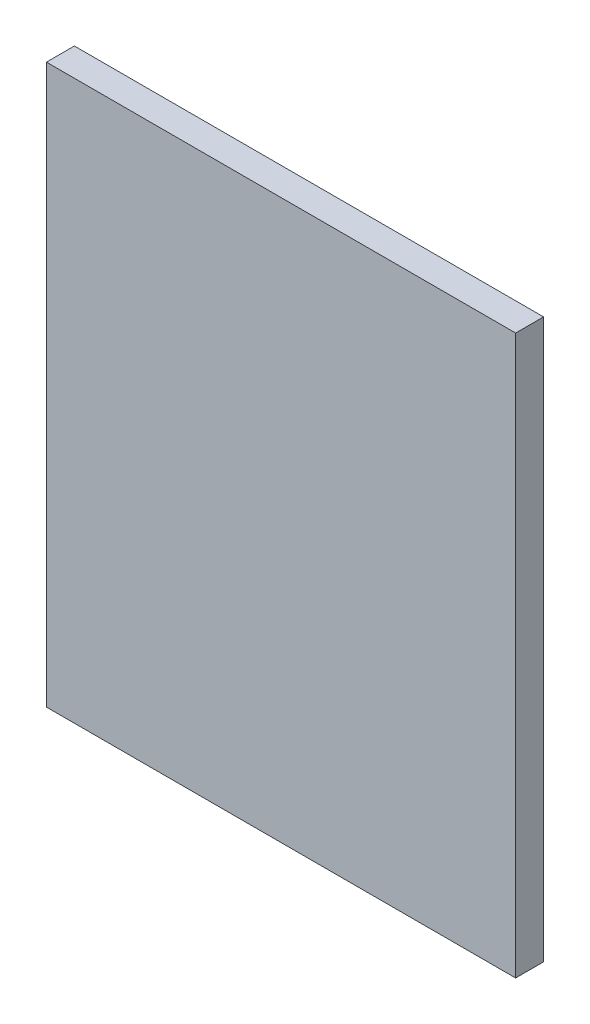
ISO-10303-21;
HEADER;
FILE_DESCRIPTION(('STEP AP214'),'2;1');
FILE_NAME('part.step','',(''),(''),'','','');
FILE_SCHEMA(('AUTOMOTIVE_DESIGN { 1 0 10303 214 1 1 1 1 }'));
ENDSEC;
DATA;
#1=APPLICATION_CONTEXT('core data for automotive mechanical design processes');
#2=APPLICATION_PROTOCOL_DEFINITION('international standard','automotive_design',2000,#1);
#3=PRODUCT_CONTEXT('',#1,'mechanical');
#4=PRODUCT('Part','Part','',(#3));
#5=PRODUCT_RELATED_PRODUCT_CATEGORY('part','',(#4));
#6=PRODUCT_DEFINITION_FORMATION('','',#4);
#7=PRODUCT_DEFINITION_CONTEXT('part definition',#1,'design');
#8=PRODUCT_DEFINITION('design','',#6,#7);
#9=PRODUCT_DEFINITION_SHAPE('','',#8);
#10=(LENGTH_UNIT() NAMED_UNIT(*) SI_UNIT(.MILLI.,.METRE.));
#11=(NAMED_UNIT(*) PLANE_ANGLE_UNIT() SI_UNIT($,.RADIAN.));
#12=(NAMED_UNIT(*) SI_UNIT($,.STERADIAN.) SOLID_ANGLE_UNIT());
#13=UNCERTAINTY_MEASURE_WITH_UNIT(LENGTH_MEASURE(1.E-05),#10,'distance_accuracy_value','');
#14=(GEOMETRIC_REPRESENTATION_CONTEXT(3) GLOBAL_UNCERTAINTY_ASSIGNED_CONTEXT((#13)) GLOBAL_UNIT_ASSIGNED_CONTEXT((#10,
#11,#12)) REPRESENTATION_CONTEXT('',''));
#15=CARTESIAN_POINT('',(0.,0.,0.));
#16=DIRECTION('',(0.,0.,1.));
#17=DIRECTION('',(1.,0.,0.));
#18=AXIS2_PLACEMENT_3D('',#15,#16,#17);
#19=CARTESIAN_POINT('',(-24.2012195121951,19.9115853658537,2.5));
#20=DIRECTION('',(1.,0.,0.));
#21=DIRECTION('',(0.,1.,0.));
#22=AXIS2_PLACEMENT_3D('',#19,#20,#21);
#23=PLANE('',#22);
#24=DIRECTION('',(0.,-1.,0.));
#25=VECTOR('',#24,1.);
#26=CARTESIAN_POINT('',(-24.2012195121951,19.9115853658537,0.));
#27=LINE('',#26,#25);
#28=CARTESIAN_POINT('',(-24.2012195121951,19.9115853658537,0.));
#29=VERTEX_POINT('',#28);
#30=CARTESIAN_POINT('',(-24.2012195121951,-30.0884146341463,0.));
#31=VERTEX_POINT('',#30);
#32=EDGE_CURVE('E96',#29,#31,#27,.T.);
#33=ORIENTED_EDGE('',*,*,#32,.T.);
#34=DIRECTION('',(0.,0.,-1.));
#35=VECTOR('',#34,1.);
#36=CARTESIAN_POINT('',(-24.2012195121951,-30.0884146341463,2.5));
#37=LINE('',#36,#35);
#38=CARTESIAN_POINT('',(-24.2012195121951,-30.0884146341463,2.5));
#39=VERTEX_POINT('',#38);
#40=EDGE_CURVE('E11',#39,#31,#37,.T.);
#41=ORIENTED_EDGE('',*,*,#40,.F.);
#42=DIRECTION('',(0.,-1.,0.));
#43=VECTOR('',#42,1.);
#44=CARTESIAN_POINT('',(-24.2012195121951,19.9115853658537,2.5));
#45=LINE('',#44,#43);
#46=CARTESIAN_POINT('',(-24.2012195121951,19.9115853658537,2.5));
#47=VERTEX_POINT('',#46);
#48=EDGE_CURVE('E84',#47,#39,#45,.T.);
#49=ORIENTED_EDGE('',*,*,#48,.F.);
#50=DIRECTION('',(0.,0.,-1.));
#51=VECTOR('',#50,1.);
#52=CARTESIAN_POINT('',(-24.2012195121951,19.9115853658537,2.5));
#53=LINE('',#52,#51);
#54=EDGE_CURVE('E92',#47,#29,#53,.T.);
#55=ORIENTED_EDGE('',*,*,#54,.T.);
#56=EDGE_LOOP('',(#33,#41,#49,#55));
#57=FACE_BOUND('',#56,.T.);
#58=ADVANCED_FACE('F33',(#57),#23,.F.);
#59=CARTESIAN_POINT('',(-24.2012195121951,-30.0884146341463,2.5));
#60=DIRECTION('',(0.,1.,0.));
#61=DIRECTION('',(0.,0.,1.));
#62=AXIS2_PLACEMENT_3D('',#59,#60,#61);
#63=PLANE('',#62);
#64=DIRECTION('',(1.,0.,0.));
#65=VECTOR('',#64,1.);
#66=CARTESIAN_POINT('',(-24.2012195121951,-30.0884146341463,0.));
#67=LINE('',#66,#65);
#68=CARTESIAN_POINT('',(17.7987804878049,-30.0884146341463,0.));
#69=VERTEX_POINT('',#68);
#70=EDGE_CURVE('E88',#31,#69,#67,.T.);
#71=ORIENTED_EDGE('',*,*,#70,.T.);
#72=DIRECTION('',(0.,0.,-1.));
#73=VECTOR('',#72,1.);
#74=CARTESIAN_POINT('',(17.7987804878049,-30.0884146341463,2.5));
#75=LINE('',#74,#73);
#76=CARTESIAN_POINT('',(17.7987804878049,-30.0884146341463,2.5));
#77=VERTEX_POINT('',#76);
#78=EDGE_CURVE('E41',#77,#69,#75,.T.);
#79=ORIENTED_EDGE('',*,*,#78,.F.);
#80=DIRECTION('',(1.,0.,0.));
#81=VECTOR('',#80,1.);
#82=CARTESIAN_POINT('',(-24.2012195121951,-30.0884146341463,2.5));
#83=LINE('',#82,#81);
#84=EDGE_CURVE('E79',#39,#77,#83,.T.);
#85=ORIENTED_EDGE('',*,*,#84,.F.);
#86=ORIENTED_EDGE('',*,*,#40,.T.);
#87=EDGE_LOOP('',(#71,#79,#85,#86));
#88=FACE_BOUND('',#87,.T.);
#89=ADVANCED_FACE('F87',(#88),#63,.F.);
#90=CARTESIAN_POINT('',(17.7987804878049,19.9115853658537,2.5));
#91=DIRECTION('',(-1.,0.,0.));
#92=DIRECTION('',(0.,-1.,0.));
#93=AXIS2_PLACEMENT_3D('',#90,#91,#92);
#94=PLANE('',#93);
#95=DIRECTION('',(0.,1.,0.));
#96=VECTOR('',#95,1.);
#97=CARTESIAN_POINT('',(17.7987804878049,19.9115853658537,0.));
#98=LINE('',#97,#96);
#99=CARTESIAN_POINT('',(17.7987804878049,19.9115853658537,0.));
#100=VERTEX_POINT('',#99);
#101=EDGE_CURVE('E66',#69,#100,#98,.T.);
#102=ORIENTED_EDGE('',*,*,#101,.T.);
#103=DIRECTION('',(0.,0.,-1.));
#104=VECTOR('',#103,1.);
#105=CARTESIAN_POINT('',(17.7987804878049,19.9115853658537,2.5));
#106=LINE('',#105,#104);
#107=CARTESIAN_POINT('',(17.7987804878049,19.9115853658537,2.5));
#108=VERTEX_POINT('',#107);
#109=EDGE_CURVE('E89',#108,#100,#106,.T.);
#110=ORIENTED_EDGE('',*,*,#109,.F.);
#111=DIRECTION('',(0.,1.,0.));
#112=VECTOR('',#111,1.);
#113=CARTESIAN_POINT('',(17.7987804878049,19.9115853658537,2.5));
#114=LINE('',#113,#112);
#115=EDGE_CURVE('E82',#77,#108,#114,.T.);
#116=ORIENTED_EDGE('',*,*,#115,.F.);
#117=ORIENTED_EDGE('',*,*,#78,.T.);
#118=EDGE_LOOP('',(#102,#110,#116,#117));
#119=FACE_BOUND('',#118,.T.);
#120=ADVANCED_FACE('F90',(#119),#94,.F.);
#121=CARTESIAN_POINT('',(-24.2012195121951,19.9115853658537,2.5));
#122=DIRECTION('',(0.,-1.,0.));
#123=DIRECTION('',(0.,0.,-1.));
#124=AXIS2_PLACEMENT_3D('',#121,#122,#123);
#125=PLANE('',#124);
#126=DIRECTION('',(-1.,0.,0.));
#127=VECTOR('',#126,1.);
#128=CARTESIAN_POINT('',(-24.2012195121951,19.9115853658537,0.));
#129=LINE('',#128,#127);
#130=EDGE_CURVE('E72',#100,#29,#129,.T.);
#131=ORIENTED_EDGE('',*,*,#130,.T.);
#132=ORIENTED_EDGE('',*,*,#54,.F.);
#133=DIRECTION('',(-1.,0.,0.));
#134=VECTOR('',#133,1.);
#135=CARTESIAN_POINT('',(-24.2012195121951,19.9115853658537,2.5));
#136=LINE('',#135,#134);
#137=EDGE_CURVE('E49',#108,#47,#136,.T.);
#138=ORIENTED_EDGE('',*,*,#137,.F.);
#139=ORIENTED_EDGE('',*,*,#109,.T.);
#140=EDGE_LOOP('',(#131,#132,#138,#139));
#141=FACE_BOUND('',#140,.T.);
#142=ADVANCED_FACE('F103',(#141),#125,.F.);
#143=CARTESIAN_POINT('',(0.,0.,2.5));
#144=DIRECTION('',(0.,0.,1.));
#145=DIRECTION('',(1.,0.,0.));
#146=AXIS2_PLACEMENT_3D('',#143,#144,#145);
#147=PLANE('',#146);
#148=ORIENTED_EDGE('',*,*,#48,.T.);
#149=ORIENTED_EDGE('',*,*,#84,.T.);
#150=ORIENTED_EDGE('',*,*,#115,.T.);
#151=ORIENTED_EDGE('',*,*,#137,.T.);
#152=EDGE_LOOP('',(#148,#149,#150,#151));
#153=FACE_BOUND('',#152,.T.);
#154=ADVANCED_FACE('F80',(#153),#147,.T.);
#155=CARTESIAN_POINT('',(0.,0.,0.));
#156=DIRECTION('',(0.,0.,1.));
#157=DIRECTION('',(1.,0.,0.));
#158=AXIS2_PLACEMENT_3D('',#155,#156,#157);
#159=PLANE('',#158);
#160=ORIENTED_EDGE('',*,*,#32,.F.);
#161=ORIENTED_EDGE('',*,*,#130,.F.);
#162=ORIENTED_EDGE('',*,*,#101,.F.);
#163=ORIENTED_EDGE('',*,*,#70,.F.);
#164=EDGE_LOOP('',(#160,#161,#162,#163));
#165=FACE_BOUND('',#164,.T.);
#166=ADVANCED_FACE('F106',(#165),#159,.F.);
#167=CLOSED_SHELL('',(#58,#89,#120,#142,#154,#166));
#168=MANIFOLD_SOLID_BREP('B2',#167);
#169=ADVANCED_BREP_SHAPE_REPRESENTATION('',(#18,#168),#14);
#170=SHAPE_DEFINITION_REPRESENTATION(#9,#169);
ENDSEC;
END-ISO-10303-21;
